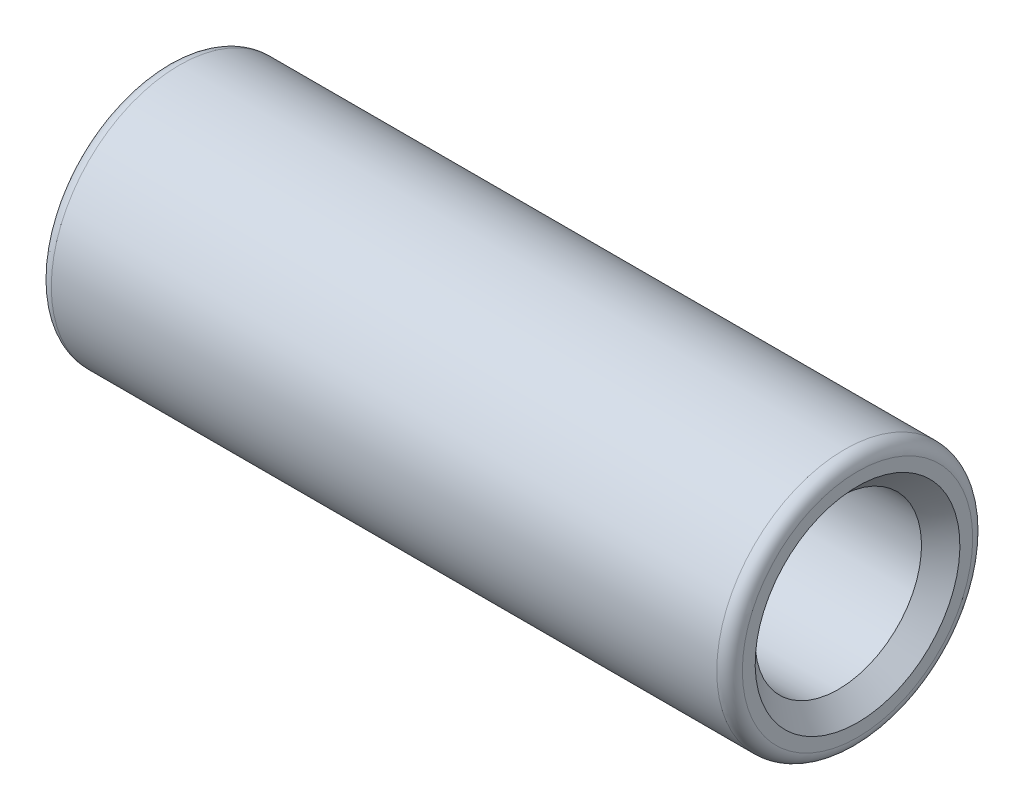
ISO-10303-21;
HEADER;
FILE_DESCRIPTION(('STEP AP214'),'2;1');
FILE_NAME('part.step','',(''),(''),'','','');
FILE_SCHEMA(('AUTOMOTIVE_DESIGN { 1 0 10303 214 1 1 1 1 }'));
ENDSEC;
DATA;
#1=APPLICATION_CONTEXT('core data for automotive mechanical design processes');
#2=APPLICATION_PROTOCOL_DEFINITION('international standard','automotive_design',2000,#1);
#3=PRODUCT_CONTEXT('',#1,'mechanical');
#4=PRODUCT('Part','Part','',(#3));
#5=PRODUCT_RELATED_PRODUCT_CATEGORY('part','',(#4));
#6=PRODUCT_DEFINITION_FORMATION('','',#4);
#7=PRODUCT_DEFINITION_CONTEXT('part definition',#1,'design');
#8=PRODUCT_DEFINITION('design','',#6,#7);
#9=PRODUCT_DEFINITION_SHAPE('','',#8);
#10=(LENGTH_UNIT() NAMED_UNIT(*) SI_UNIT(.MILLI.,.METRE.));
#11=(NAMED_UNIT(*) PLANE_ANGLE_UNIT() SI_UNIT($,.RADIAN.));
#12=(NAMED_UNIT(*) SI_UNIT($,.STERADIAN.) SOLID_ANGLE_UNIT());
#13=UNCERTAINTY_MEASURE_WITH_UNIT(LENGTH_MEASURE(1.E-05),#10,'distance_accuracy_value','');
#14=(GEOMETRIC_REPRESENTATION_CONTEXT(3) GLOBAL_UNCERTAINTY_ASSIGNED_CONTEXT((#13)) GLOBAL_UNIT_ASSIGNED_CONTEXT((#10,
#11,#12)) REPRESENTATION_CONTEXT('',''));
#15=CARTESIAN_POINT('',(0.,0.,0.));
#16=DIRECTION('',(0.,0.,1.));
#17=DIRECTION('',(1.,0.,0.));
#18=AXIS2_PLACEMENT_3D('',#15,#16,#17);
#19=CARTESIAN_POINT('',(25.,0.,0.));
#20=DIRECTION('',(1.,0.,0.));
#21=DIRECTION('',(0.,1.,0.));
#22=AXIS2_PLACEMENT_3D('',#19,#20,#21);
#23=PLANE('',#22);
#24=CARTESIAN_POINT('',(25.,0.,0.));
#25=DIRECTION('',(-1.,0.,0.));
#26=DIRECTION('',(0.,-1.,0.));
#27=AXIS2_PLACEMENT_3D('',#24,#25,#26);
#28=CIRCLE('',#27,4.05);
#29=CARTESIAN_POINT('',(25.,-4.05,0.));
#30=VERTEX_POINT('',#29);
#31=EDGE_CURVE('E73',#30,#30,#28,.T.);
#32=ORIENTED_EDGE('',*,*,#31,.T.);
#33=EDGE_LOOP('',(#32));
#34=FACE_BOUND('',#33,.T.);
#35=ADVANCED_FACE('F35',(#34),#23,.F.);
#36=CARTESIAN_POINT('',(0.,0.,0.));
#37=DIRECTION('',(-1.,0.,0.));
#38=DIRECTION('',(0.,-1.,0.));
#39=AXIS2_PLACEMENT_3D('',#36,#37,#38);
#40=CYLINDRICAL_SURFACE('',#39,4.05);
#41=CARTESIAN_POINT('',(1.49999999999999,0.,0.));
#42=DIRECTION('',(1.,0.,0.));
#43=DIRECTION('',(0.,1.,0.));
#44=AXIS2_PLACEMENT_3D('',#41,#42,#43);
#45=CIRCLE('',#44,4.05);
#46=CARTESIAN_POINT('',(1.49999999999999,4.05,0.));
#47=VERTEX_POINT('',#46);
#48=EDGE_CURVE('E58',#47,#47,#45,.F.);
#49=ORIENTED_EDGE('',*,*,#48,.T.);
#50=EDGE_LOOP('',(#49));
#51=FACE_BOUND('',#50,.T.);
#52=ORIENTED_EDGE('',*,*,#31,.F.);
#53=EDGE_LOOP('',(#52));
#54=FACE_BOUND('',#53,.T.);
#55=ADVANCED_FACE('F101',(#51,#54),#40,.F.);
#56=CARTESIAN_POINT('',(0.,9.99999999999999,0.));
#57=DIRECTION('',(1.,0.,0.));
#58=DIRECTION('',(0.,1.,0.));
#59=AXIS2_PLACEMENT_3D('',#56,#57,#58);
#60=PLANE('',#59);
#61=CARTESIAN_POINT('',(0.,0.,0.));
#62=DIRECTION('',(1.,0.,0.));
#63=DIRECTION('',(0.,1.,0.));
#64=AXIS2_PLACEMENT_3D('',#61,#62,#63);
#65=CIRCLE('',#64,9.);
#66=CARTESIAN_POINT('',(0.,9.,0.));
#67=VERTEX_POINT('',#66);
#68=EDGE_CURVE('E50',#67,#67,#65,.F.);
#69=ORIENTED_EDGE('',*,*,#68,.T.);
#70=EDGE_LOOP('',(#69));
#71=FACE_BOUND('',#70,.T.);
#72=CARTESIAN_POINT('',(0.,0.,0.));
#73=DIRECTION('',(1.,0.,0.));
#74=DIRECTION('',(0.,1.,0.));
#75=AXIS2_PLACEMENT_3D('',#72,#73,#74);
#76=CIRCLE('',#75,5.55);
#77=CARTESIAN_POINT('',(0.,5.55,0.));
#78=VERTEX_POINT('',#77);
#79=EDGE_CURVE('E55',#78,#78,#76,.T.);
#80=ORIENTED_EDGE('',*,*,#79,.T.);
#81=EDGE_LOOP('',(#80));
#82=FACE_BOUND('',#81,.T.);
#83=ADVANCED_FACE('F107',(#71,#82),#60,.F.);
#84=CARTESIAN_POINT('',(0.,0.,0.));
#85=DIRECTION('',(-1.,0.,0.));
#86=DIRECTION('',(0.,-1.,0.));
#87=AXIS2_PLACEMENT_3D('',#84,#85,#86);
#88=CYLINDRICAL_SURFACE('',#87,10.);
#89=CARTESIAN_POINT('',(1.,0.,0.));
#90=DIRECTION('',(1.,0.,0.));
#91=DIRECTION('',(0.,1.,0.));
#92=AXIS2_PLACEMENT_3D('',#89,#90,#91);
#93=CIRCLE('',#92,10.);
#94=CARTESIAN_POINT('',(1.,10.,0.));
#95=VERTEX_POINT('',#94);
#96=EDGE_CURVE('E42',#95,#95,#93,.T.);
#97=ORIENTED_EDGE('',*,*,#96,.T.);
#98=EDGE_LOOP('',(#97));
#99=FACE_BOUND('',#98,.T.);
#100=CARTESIAN_POINT('',(53.,0.,0.));
#101=DIRECTION('',(-1.,0.,0.));
#102=DIRECTION('',(0.,-1.,0.));
#103=AXIS2_PLACEMENT_3D('',#100,#101,#102);
#104=CIRCLE('',#103,10.);
#105=CARTESIAN_POINT('',(53.,-10.,0.));
#106=VERTEX_POINT('',#105);
#107=EDGE_CURVE('E46',#106,#106,#104,.T.);
#108=ORIENTED_EDGE('',*,*,#107,.T.);
#109=EDGE_LOOP('',(#108));
#110=FACE_BOUND('',#109,.T.);
#111=ADVANCED_FACE('F143',(#99,#110),#88,.T.);
#112=CARTESIAN_POINT('',(54.,10.,0.));
#113=DIRECTION('',(-1.,0.,0.));
#114=DIRECTION('',(0.,-1.,0.));
#115=AXIS2_PLACEMENT_3D('',#112,#113,#114);
#116=PLANE('',#115);
#117=CARTESIAN_POINT('',(54.,0.,0.));
#118=DIRECTION('',(-1.,0.,0.));
#119=DIRECTION('',(0.,-1.,0.));
#120=AXIS2_PLACEMENT_3D('',#117,#118,#119);
#121=CIRCLE('',#120,9.);
#122=CARTESIAN_POINT('',(54.,-9.,0.));
#123=VERTEX_POINT('',#122);
#124=EDGE_CURVE('E10',#123,#123,#121,.F.);
#125=ORIENTED_EDGE('',*,*,#124,.T.);
#126=EDGE_LOOP('',(#125));
#127=FACE_BOUND('',#126,.T.);
#128=CARTESIAN_POINT('',(54.,0.,0.));
#129=DIRECTION('',(-1.,0.,0.));
#130=DIRECTION('',(0.,-1.,0.));
#131=AXIS2_PLACEMENT_3D('',#128,#129,#130);
#132=CIRCLE('',#131,8.00000000000001);
#133=CARTESIAN_POINT('',(54.,-8.00000000000001,0.));
#134=VERTEX_POINT('',#133);
#135=EDGE_CURVE('E64',#134,#134,#132,.T.);
#136=ORIENTED_EDGE('',*,*,#135,.T.);
#137=EDGE_LOOP('',(#136));
#138=FACE_BOUND('',#137,.T.);
#139=ADVANCED_FACE('F152',(#127,#138),#116,.F.);
#140=CARTESIAN_POINT('',(0.,0.,0.));
#141=DIRECTION('',(-1.,0.,0.));
#142=DIRECTION('',(0.,-1.,0.));
#143=AXIS2_PLACEMENT_3D('',#140,#141,#142);
#144=CYLINDRICAL_SURFACE('',#143,6.5);
#145=CARTESIAN_POINT('',(52.5,0.,0.));
#146=DIRECTION('',(-1.,0.,0.));
#147=DIRECTION('',(0.,-1.,0.));
#148=AXIS2_PLACEMENT_3D('',#145,#146,#147);
#149=CIRCLE('',#148,6.5);
#150=CARTESIAN_POINT('',(52.5,-6.5,0.));
#151=VERTEX_POINT('',#150);
#152=EDGE_CURVE('E61',#151,#151,#149,.F.);
#153=ORIENTED_EDGE('',*,*,#152,.T.);
#154=EDGE_LOOP('',(#153));
#155=FACE_BOUND('',#154,.T.);
#156=CARTESIAN_POINT('',(30.,0.,0.));
#157=DIRECTION('',(-1.,0.,0.));
#158=DIRECTION('',(0.,-1.,0.));
#159=AXIS2_PLACEMENT_3D('',#156,#157,#158);
#160=CIRCLE('',#159,6.5);
#161=CARTESIAN_POINT('',(30.,-6.5,0.));
#162=VERTEX_POINT('',#161);
#163=EDGE_CURVE('E76',#162,#162,#160,.T.);
#164=ORIENTED_EDGE('',*,*,#163,.T.);
#165=EDGE_LOOP('',(#164));
#166=FACE_BOUND('',#165,.T.);
#167=ADVANCED_FACE('F97',(#155,#166),#144,.F.);
#168=CARTESIAN_POINT('',(30.,6.5,0.));
#169=DIRECTION('',(-1.,0.,0.));
#170=DIRECTION('',(0.,-1.,0.));
#171=AXIS2_PLACEMENT_3D('',#168,#169,#170);
#172=PLANE('',#171);
#173=ORIENTED_EDGE('',*,*,#163,.F.);
#174=EDGE_LOOP('',(#173));
#175=FACE_BOUND('',#174,.T.);
#176=CARTESIAN_POINT('',(30.,0.,0.));
#177=DIRECTION('',(-1.,0.,0.));
#178=DIRECTION('',(0.,-1.,0.));
#179=AXIS2_PLACEMENT_3D('',#176,#177,#178);
#180=CIRCLE('',#179,2.775);
#181=CARTESIAN_POINT('',(30.,-2.775,0.));
#182=VERTEX_POINT('',#181);
#183=EDGE_CURVE('E79',#182,#182,#180,.T.);
#184=ORIENTED_EDGE('',*,*,#183,.T.);
#185=EDGE_LOOP('',(#184));
#186=FACE_BOUND('',#185,.T.);
#187=ADVANCED_FACE('F83',(#175,#186),#172,.F.);
#188=CARTESIAN_POINT('',(0.,0.,0.));
#189=DIRECTION('',(-1.,0.,0.));
#190=DIRECTION('',(0.,-1.,0.));
#191=AXIS2_PLACEMENT_3D('',#188,#189,#190);
#192=CYLINDRICAL_SURFACE('',#191,2.775);
#193=CARTESIAN_POINT('',(34.5,0.,0.));
#194=DIRECTION('',(-1.,0.,0.));
#195=DIRECTION('',(0.,-1.,0.));
#196=AXIS2_PLACEMENT_3D('',#193,#194,#195);
#197=CIRCLE('',#196,2.775);
#198=CARTESIAN_POINT('',(34.5,-2.775,0.));
#199=VERTEX_POINT('',#198);
#200=EDGE_CURVE('E70',#199,#199,#197,.T.);
#201=ORIENTED_EDGE('',*,*,#200,.T.);
#202=EDGE_LOOP('',(#201));
#203=FACE_BOUND('',#202,.T.);
#204=ORIENTED_EDGE('',*,*,#183,.F.);
#205=EDGE_LOOP('',(#204));
#206=FACE_BOUND('',#205,.T.);
#207=ADVANCED_FACE('F85',(#203,#206),#192,.T.);
#208=CARTESIAN_POINT('',(36.,2.775,0.));
#209=DIRECTION('',(-1.,0.,0.));
#210=DIRECTION('',(0.,-1.,0.));
#211=AXIS2_PLACEMENT_3D('',#208,#209,#210);
#212=PLANE('',#211);
#213=CARTESIAN_POINT('',(36.,0.,0.));
#214=DIRECTION('',(-1.,0.,0.));
#215=DIRECTION('',(0.,-1.,0.));
#216=AXIS2_PLACEMENT_3D('',#213,#214,#215);
#217=CIRCLE('',#216,1.275);
#218=CARTESIAN_POINT('',(36.,-1.275,0.));
#219=VERTEX_POINT('',#218);
#220=EDGE_CURVE('E67',#219,#219,#217,.F.);
#221=ORIENTED_EDGE('',*,*,#220,.T.);
#222=EDGE_LOOP('',(#221));
#223=FACE_BOUND('',#222,.T.);
#224=ADVANCED_FACE('F87',(#223),#212,.F.);
#225=CARTESIAN_POINT('',(34.5,0.,0.));
#226=DIRECTION('',(-1.,0.,0.));
#227=DIRECTION('',(0.,-1.,0.));
#228=AXIS2_PLACEMENT_3D('',#225,#226,#227);
#229=CONICAL_SURFACE('',#228,2.775,0.785398163397451);
#230=ORIENTED_EDGE('',*,*,#220,.F.);
#231=EDGE_LOOP('',(#230));
#232=FACE_BOUND('',#231,.T.);
#233=ORIENTED_EDGE('',*,*,#200,.F.);
#234=EDGE_LOOP('',(#233));
#235=FACE_BOUND('',#234,.T.);
#236=ADVANCED_FACE('F94',(#232,#235),#229,.T.);
#237=CARTESIAN_POINT('',(54.,0.,0.));
#238=DIRECTION('',(1.,0.,0.));
#239=DIRECTION('',(0.,1.,0.));
#240=AXIS2_PLACEMENT_3D('',#237,#238,#239);
#241=CONICAL_SURFACE('',#240,8.00000000000001,0.785398163397446);
#242=ORIENTED_EDGE('',*,*,#152,.F.);
#243=EDGE_LOOP('',(#242));
#244=FACE_BOUND('',#243,.T.);
#245=ORIENTED_EDGE('',*,*,#135,.F.);
#246=EDGE_LOOP('',(#245));
#247=FACE_BOUND('',#246,.T.);
#248=ADVANCED_FACE('F118',(#244,#247),#241,.F.);
#249=CARTESIAN_POINT('',(1.49999999999999,0.,0.));
#250=DIRECTION('',(-1.,0.,0.));
#251=DIRECTION('',(0.,-1.,0.));
#252=AXIS2_PLACEMENT_3D('',#249,#250,#251);
#253=CONICAL_SURFACE('',#252,4.05,0.785398163397451);
#254=ORIENTED_EDGE('',*,*,#79,.F.);
#255=EDGE_LOOP('',(#254));
#256=FACE_BOUND('',#255,.T.);
#257=ORIENTED_EDGE('',*,*,#48,.F.);
#258=EDGE_LOOP('',(#257));
#259=FACE_BOUND('',#258,.T.);
#260=ADVANCED_FACE('F125',(#256,#259),#253,.F.);
#261=CARTESIAN_POINT('',(1.,0.,0.));
#262=DIRECTION('',(1.,0.,0.));
#263=DIRECTION('',(0.,1.,0.));
#264=AXIS2_PLACEMENT_3D('',#261,#262,#263);
#265=TOROIDAL_SURFACE('',#264,9.,1.);
#266=ORIENTED_EDGE('',*,*,#96,.F.);
#267=EDGE_LOOP('',(#266));
#268=FACE_BOUND('',#267,.T.);
#269=ORIENTED_EDGE('',*,*,#68,.F.);
#270=EDGE_LOOP('',(#269));
#271=FACE_BOUND('',#270,.T.);
#272=ADVANCED_FACE('F130',(#268,#271),#265,.T.);
#273=CARTESIAN_POINT('',(53.,0.,0.));
#274=DIRECTION('',(-1.,0.,0.));
#275=DIRECTION('',(0.,-1.,0.));
#276=AXIS2_PLACEMENT_3D('',#273,#274,#275);
#277=TOROIDAL_SURFACE('',#276,9.,1.);
#278=ORIENTED_EDGE('',*,*,#124,.F.);
#279=EDGE_LOOP('',(#278));
#280=FACE_BOUND('',#279,.T.);
#281=ORIENTED_EDGE('',*,*,#107,.F.);
#282=EDGE_LOOP('',(#281));
#283=FACE_BOUND('',#282,.T.);
#284=ADVANCED_FACE('F37',(#280,#283),#277,.T.);
#285=CLOSED_SHELL('',(#35,#55,#83,#111,#139,#167,#187,#207,#224,#236,#248,#260,#272,#284));
#286=MANIFOLD_SOLID_BREP('B2',#285);
#287=ADVANCED_BREP_SHAPE_REPRESENTATION('',(#18,#286),#14);
#288=SHAPE_DEFINITION_REPRESENTATION(#9,#287);
ENDSEC;
END-ISO-10303-21;
